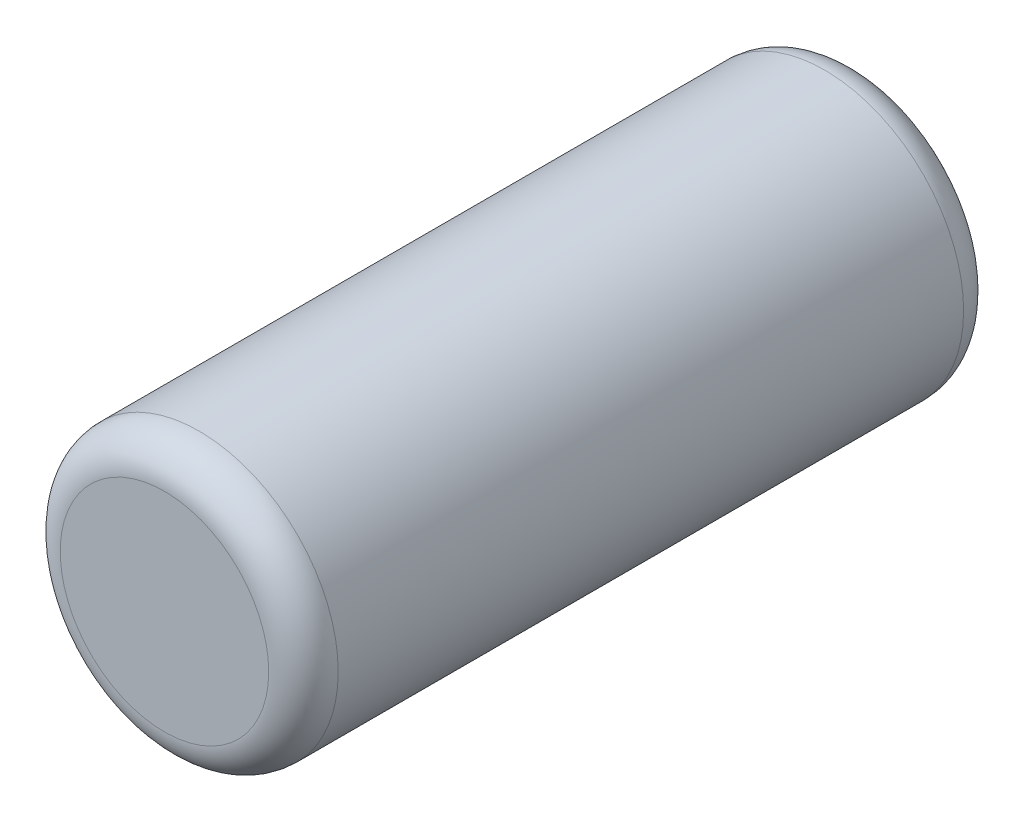
ISO-10303-21;
HEADER;
FILE_DESCRIPTION(('STEP AP214'),'2;1');
FILE_NAME('part.step','',(''),(''),'','','');
FILE_SCHEMA(('AUTOMOTIVE_DESIGN { 1 0 10303 214 1 1 1 1 }'));
ENDSEC;
DATA;
#1=APPLICATION_CONTEXT('core data for automotive mechanical design processes');
#2=APPLICATION_PROTOCOL_DEFINITION('international standard','automotive_design',2000,#1);
#3=PRODUCT_CONTEXT('',#1,'mechanical');
#4=PRODUCT('Part','Part','',(#3));
#5=PRODUCT_RELATED_PRODUCT_CATEGORY('part','',(#4));
#6=PRODUCT_DEFINITION_FORMATION('','',#4);
#7=PRODUCT_DEFINITION_CONTEXT('part definition',#1,'design');
#8=PRODUCT_DEFINITION('design','',#6,#7);
#9=PRODUCT_DEFINITION_SHAPE('','',#8);
#10=(LENGTH_UNIT() NAMED_UNIT(*) SI_UNIT(.MILLI.,.METRE.));
#11=(NAMED_UNIT(*) PLANE_ANGLE_UNIT() SI_UNIT($,.RADIAN.));
#12=(NAMED_UNIT(*) SI_UNIT($,.STERADIAN.) SOLID_ANGLE_UNIT());
#13=UNCERTAINTY_MEASURE_WITH_UNIT(LENGTH_MEASURE(1.E-05),#10,'distance_accuracy_value','');
#14=(GEOMETRIC_REPRESENTATION_CONTEXT(3) GLOBAL_UNCERTAINTY_ASSIGNED_CONTEXT((#13)) GLOBAL_UNIT_ASSIGNED_CONTEXT((#10,
#11,#12)) REPRESENTATION_CONTEXT('',''));
#15=CARTESIAN_POINT('',(0.,0.,0.));
#16=DIRECTION('',(0.,0.,1.));
#17=DIRECTION('',(1.,0.,0.));
#18=AXIS2_PLACEMENT_3D('',#15,#16,#17);
#19=CARTESIAN_POINT('',(0.,0.,20.));
#20=DIRECTION('',(0.,0.,-1.));
#21=DIRECTION('',(-1.,0.,0.));
#22=AXIS2_PLACEMENT_3D('',#19,#20,#21);
#23=CYLINDRICAL_SURFACE('',#22,4.);
#24=CARTESIAN_POINT('',(0.,0.,19.));
#25=DIRECTION('',(0.,0.,1.));
#26=DIRECTION('',(1.,0.,0.));
#27=AXIS2_PLACEMENT_3D('',#24,#25,#26);
#28=CIRCLE('',#27,4.);
#29=CARTESIAN_POINT('',(4.,0.,19.));
#30=VERTEX_POINT('',#29);
#31=EDGE_CURVE('E38',#30,#30,#28,.F.);
#32=ORIENTED_EDGE('',*,*,#31,.T.);
#33=EDGE_LOOP('',(#32));
#34=FACE_BOUND('',#33,.T.);
#35=CARTESIAN_POINT('',(0.,0.,1.));
#36=DIRECTION('',(0.,0.,1.));
#37=DIRECTION('',(1.,0.,0.));
#38=AXIS2_PLACEMENT_3D('',#35,#36,#37);
#39=CIRCLE('',#38,4.);
#40=CARTESIAN_POINT('',(4.,0.,1.));
#41=VERTEX_POINT('',#40);
#42=EDGE_CURVE('E42',#41,#41,#39,.T.);
#43=ORIENTED_EDGE('',*,*,#42,.T.);
#44=EDGE_LOOP('',(#43));
#45=FACE_BOUND('',#44,.T.);
#46=ADVANCED_FACE('F31',(#34,#45),#23,.T.);
#47=CARTESIAN_POINT('',(0.,0.,20.));
#48=DIRECTION('',(0.,0.,1.));
#49=DIRECTION('',(1.,0.,0.));
#50=AXIS2_PLACEMENT_3D('',#47,#48,#49);
#51=PLANE('',#50);
#52=CARTESIAN_POINT('',(0.,0.,20.));
#53=DIRECTION('',(0.,0.,1.));
#54=DIRECTION('',(1.,0.,0.));
#55=AXIS2_PLACEMENT_3D('',#52,#53,#54);
#56=CIRCLE('',#55,3.);
#57=CARTESIAN_POINT('',(3.,0.,20.));
#58=VERTEX_POINT('',#57);
#59=EDGE_CURVE('E46',#58,#58,#56,.T.);
#60=ORIENTED_EDGE('',*,*,#59,.T.);
#61=EDGE_LOOP('',(#60));
#62=FACE_BOUND('',#61,.T.);
#63=ADVANCED_FACE('F52',(#62),#51,.T.);
#64=CARTESIAN_POINT('',(0.,0.,0.));
#65=DIRECTION('',(0.,0.,1.));
#66=DIRECTION('',(1.,0.,0.));
#67=AXIS2_PLACEMENT_3D('',#64,#65,#66);
#68=PLANE('',#67);
#69=CARTESIAN_POINT('',(0.,0.,0.));
#70=DIRECTION('',(0.,0.,1.));
#71=DIRECTION('',(1.,0.,0.));
#72=AXIS2_PLACEMENT_3D('',#69,#70,#71);
#73=CIRCLE('',#72,3.);
#74=CARTESIAN_POINT('',(3.,0.,0.));
#75=VERTEX_POINT('',#74);
#76=EDGE_CURVE('E10',#75,#75,#73,.F.);
#77=ORIENTED_EDGE('',*,*,#76,.T.);
#78=EDGE_LOOP('',(#77));
#79=FACE_BOUND('',#78,.T.);
#80=ADVANCED_FACE('F56',(#79),#68,.F.);
#81=CARTESIAN_POINT('',(0.,0.,19.));
#82=DIRECTION('',(0.,0.,1.));
#83=DIRECTION('',(1.,0.,0.));
#84=AXIS2_PLACEMENT_3D('',#81,#82,#83);
#85=TOROIDAL_SURFACE('',#84,3.,1.);
#86=ORIENTED_EDGE('',*,*,#31,.F.);
#87=EDGE_LOOP('',(#86));
#88=FACE_BOUND('',#87,.T.);
#89=ORIENTED_EDGE('',*,*,#59,.F.);
#90=EDGE_LOOP('',(#89));
#91=FACE_BOUND('',#90,.T.);
#92=ADVANCED_FACE('F54',(#88,#91),#85,.T.);
#93=CARTESIAN_POINT('',(0.,0.,1.));
#94=DIRECTION('',(0.,0.,1.));
#95=DIRECTION('',(1.,0.,0.));
#96=AXIS2_PLACEMENT_3D('',#93,#94,#95);
#97=TOROIDAL_SURFACE('',#96,3.,1.);
#98=ORIENTED_EDGE('',*,*,#76,.F.);
#99=EDGE_LOOP('',(#98));
#100=FACE_BOUND('',#99,.T.);
#101=ORIENTED_EDGE('',*,*,#42,.F.);
#102=EDGE_LOOP('',(#101));
#103=FACE_BOUND('',#102,.T.);
#104=ADVANCED_FACE('F33',(#100,#103),#97,.T.);
#105=CLOSED_SHELL('',(#46,#63,#80,#92,#104));
#106=MANIFOLD_SOLID_BREP('B2',#105);
#107=ADVANCED_BREP_SHAPE_REPRESENTATION('',(#18,#106),#14);
#108=SHAPE_DEFINITION_REPRESENTATION(#9,#107);
ENDSEC;
END-ISO-10303-21;
